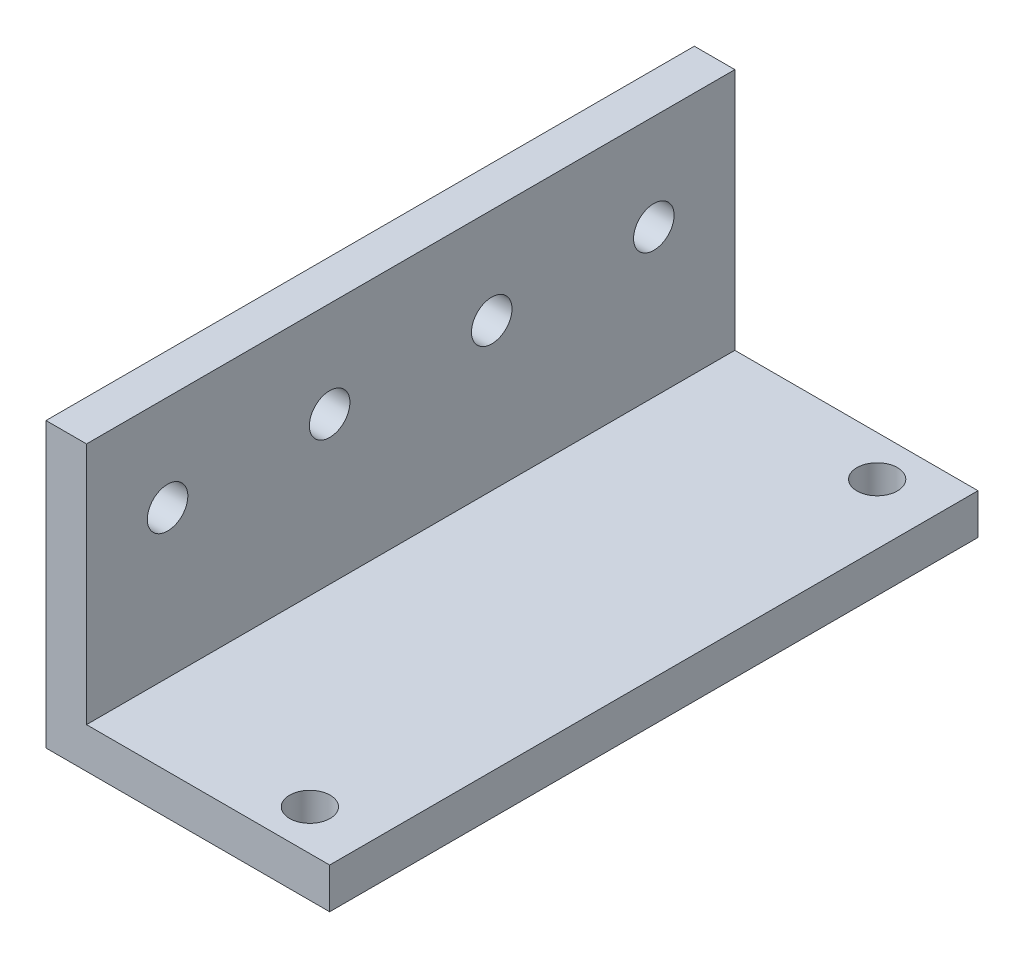
ISO-10303-21;
HEADER;
FILE_DESCRIPTION(('STEP AP214'),'2;1');
FILE_NAME('part.step','',(''),(''),'','','');
FILE_SCHEMA(('AUTOMOTIVE_DESIGN { 1 0 10303 214 1 1 1 1 }'));
ENDSEC;
DATA;
#1=APPLICATION_CONTEXT('core data for automotive mechanical design processes');
#2=APPLICATION_PROTOCOL_DEFINITION('international standard','automotive_design',2000,#1);
#3=PRODUCT_CONTEXT('',#1,'mechanical');
#4=PRODUCT('Part','Part','',(#3));
#5=PRODUCT_RELATED_PRODUCT_CATEGORY('part','',(#4));
#6=PRODUCT_DEFINITION_FORMATION('','',#4);
#7=PRODUCT_DEFINITION_CONTEXT('part definition',#1,'design');
#8=PRODUCT_DEFINITION('design','',#6,#7);
#9=PRODUCT_DEFINITION_SHAPE('','',#8);
#10=(LENGTH_UNIT() NAMED_UNIT(*) SI_UNIT(.MILLI.,.METRE.));
#11=(NAMED_UNIT(*) PLANE_ANGLE_UNIT() SI_UNIT($,.RADIAN.));
#12=(NAMED_UNIT(*) SI_UNIT($,.STERADIAN.) SOLID_ANGLE_UNIT());
#13=UNCERTAINTY_MEASURE_WITH_UNIT(LENGTH_MEASURE(1.E-05),#10,'distance_accuracy_value','');
#14=(GEOMETRIC_REPRESENTATION_CONTEXT(3) GLOBAL_UNCERTAINTY_ASSIGNED_CONTEXT((#13)) GLOBAL_UNIT_ASSIGNED_CONTEXT((#10,
#11,#12)) REPRESENTATION_CONTEXT('',''));
#15=CARTESIAN_POINT('',(0.,0.,0.));
#16=DIRECTION('',(0.,0.,1.));
#17=DIRECTION('',(1.,0.,0.));
#18=AXIS2_PLACEMENT_3D('',#15,#16,#17);
#19=CARTESIAN_POINT('',(6.35000000000001,0.,101.6));
#20=DIRECTION('',(1.,0.,0.));
#21=DIRECTION('',(0.,1.,0.));
#22=AXIS2_PLACEMENT_3D('',#19,#20,#21);
#23=PLANE('',#22);
#24=CARTESIAN_POINT('',(6.35,29.45,38.1));
#25=DIRECTION('',(1.,0.,0.));
#26=DIRECTION('',(0.,1.,0.));
#27=AXIS2_PLACEMENT_3D('',#24,#25,#26);
#28=CIRCLE('',#27,3.175);
#29=CARTESIAN_POINT('',(6.35,32.625,38.1));
#30=VERTEX_POINT('',#29);
#31=EDGE_CURVE('E154',#30,#30,#28,.T.);
#32=ORIENTED_EDGE('',*,*,#31,.F.);
#33=EDGE_LOOP('',(#32));
#34=FACE_BOUND('',#33,.T.);
#35=CARTESIAN_POINT('',(6.35,29.45,88.9));
#36=DIRECTION('',(1.,0.,0.));
#37=DIRECTION('',(0.,1.,0.));
#38=AXIS2_PLACEMENT_3D('',#35,#36,#37);
#39=CIRCLE('',#38,3.175);
#40=CARTESIAN_POINT('',(6.35,32.625,88.9));
#41=VERTEX_POINT('',#40);
#42=EDGE_CURVE('E144',#41,#41,#39,.T.);
#43=ORIENTED_EDGE('',*,*,#42,.F.);
#44=EDGE_LOOP('',(#43));
#45=FACE_BOUND('',#44,.T.);
#46=CARTESIAN_POINT('',(6.35,29.45,63.5));
#47=DIRECTION('',(1.,0.,0.));
#48=DIRECTION('',(0.,1.,0.));
#49=AXIS2_PLACEMENT_3D('',#46,#47,#48);
#50=CIRCLE('',#49,3.175);
#51=CARTESIAN_POINT('',(6.35,32.625,63.5));
#52=VERTEX_POINT('',#51);
#53=EDGE_CURVE('E141',#52,#52,#50,.T.);
#54=ORIENTED_EDGE('',*,*,#53,.F.);
#55=EDGE_LOOP('',(#54));
#56=FACE_BOUND('',#55,.T.);
#57=CARTESIAN_POINT('',(6.35,29.45,12.7));
#58=DIRECTION('',(1.,0.,0.));
#59=DIRECTION('',(0.,1.,0.));
#60=AXIS2_PLACEMENT_3D('',#57,#58,#59);
#61=CIRCLE('',#60,3.175);
#62=CARTESIAN_POINT('',(6.35,32.625,12.7));
#63=VERTEX_POINT('',#62);
#64=EDGE_CURVE('E138',#63,#63,#61,.T.);
#65=ORIENTED_EDGE('',*,*,#64,.F.);
#66=EDGE_LOOP('',(#65));
#67=FACE_BOUND('',#66,.T.);
#68=DIRECTION('',(0.,-1.,0.));
#69=VECTOR('',#68,1.);
#70=CARTESIAN_POINT('',(6.35000000000001,0.,0.));
#71=LINE('',#70,#69);
#72=CARTESIAN_POINT('',(6.35,44.45,0.));
#73=VERTEX_POINT('',#72);
#74=CARTESIAN_POINT('',(6.35000000000001,6.34999999999999,0.));
#75=VERTEX_POINT('',#74);
#76=EDGE_CURVE('E115',#73,#75,#71,.T.);
#77=ORIENTED_EDGE('',*,*,#76,.F.);
#78=DIRECTION('',(0.,0.,-1.));
#79=VECTOR('',#78,1.);
#80=CARTESIAN_POINT('',(6.35,44.45,101.6));
#81=LINE('',#80,#79);
#82=CARTESIAN_POINT('',(6.35,44.45,101.6));
#83=VERTEX_POINT('',#82);
#84=EDGE_CURVE('E11',#83,#73,#81,.T.);
#85=ORIENTED_EDGE('',*,*,#84,.F.);
#86=DIRECTION('',(0.,-1.,0.));
#87=VECTOR('',#86,1.);
#88=CARTESIAN_POINT('',(6.35000000000001,0.,101.6));
#89=LINE('',#88,#87);
#90=CARTESIAN_POINT('',(6.35000000000001,6.34999999999999,101.6));
#91=VERTEX_POINT('',#90);
#92=EDGE_CURVE('E129',#83,#91,#89,.T.);
#93=ORIENTED_EDGE('',*,*,#92,.T.);
#94=DIRECTION('',(0.,0.,-1.));
#95=VECTOR('',#94,1.);
#96=CARTESIAN_POINT('',(6.35000000000001,6.34999999999999,101.6));
#97=LINE('',#96,#95);
#98=EDGE_CURVE('E80',#91,#75,#97,.T.);
#99=ORIENTED_EDGE('',*,*,#98,.T.);
#100=EDGE_LOOP('',(#77,#85,#93,#99));
#101=FACE_BOUND('',#100,.T.);
#102=ADVANCED_FACE('F33',(#34,#45,#56,#67,#101),#23,.T.);
#103=CARTESIAN_POINT('',(0.,44.45,101.6));
#104=DIRECTION('',(0.,1.,0.));
#105=DIRECTION('',(0.,0.,1.));
#106=AXIS2_PLACEMENT_3D('',#103,#104,#105);
#107=PLANE('',#106);
#108=DIRECTION('',(1.,0.,0.));
#109=VECTOR('',#108,1.);
#110=CARTESIAN_POINT('',(0.,44.45,0.));
#111=LINE('',#110,#109);
#112=CARTESIAN_POINT('',(0.,44.45,0.));
#113=VERTEX_POINT('',#112);
#114=EDGE_CURVE('E118',#113,#73,#111,.T.);
#115=ORIENTED_EDGE('',*,*,#114,.F.);
#116=DIRECTION('',(0.,0.,-1.));
#117=VECTOR('',#116,1.);
#118=CARTESIAN_POINT('',(0.,44.45,101.6));
#119=LINE('',#118,#117);
#120=CARTESIAN_POINT('',(0.,44.45,101.6));
#121=VERTEX_POINT('',#120);
#122=EDGE_CURVE('E42',#121,#113,#119,.T.);
#123=ORIENTED_EDGE('',*,*,#122,.F.);
#124=DIRECTION('',(1.,0.,0.));
#125=VECTOR('',#124,1.);
#126=CARTESIAN_POINT('',(0.,44.45,101.6));
#127=LINE('',#126,#125);
#128=EDGE_CURVE('E170',#121,#83,#127,.T.);
#129=ORIENTED_EDGE('',*,*,#128,.T.);
#130=ORIENTED_EDGE('',*,*,#84,.T.);
#131=EDGE_LOOP('',(#115,#123,#129,#130));
#132=FACE_BOUND('',#131,.T.);
#133=ADVANCED_FACE('F182',(#132),#107,.T.);
#134=CARTESIAN_POINT('',(0.,0.,101.6));
#135=DIRECTION('',(-1.,0.,0.));
#136=DIRECTION('',(0.,0.,1.));
#137=AXIS2_PLACEMENT_3D('',#134,#135,#136);
#138=PLANE('',#137);
#139=CARTESIAN_POINT('',(0.,29.45,38.1));
#140=DIRECTION('',(-1.,0.,0.));
#141=DIRECTION('',(0.,0.,1.));
#142=AXIS2_PLACEMENT_3D('',#139,#140,#141);
#143=CIRCLE('',#142,3.175);
#144=CARTESIAN_POINT('',(0.,29.45,41.275));
#145=VERTEX_POINT('',#144);
#146=EDGE_CURVE('E36',#145,#145,#143,.T.);
#147=ORIENTED_EDGE('',*,*,#146,.F.);
#148=EDGE_LOOP('',(#147));
#149=FACE_BOUND('',#148,.T.);
#150=CARTESIAN_POINT('',(0.,29.45,88.9));
#151=DIRECTION('',(-1.,0.,0.));
#152=DIRECTION('',(0.,0.,1.));
#153=AXIS2_PLACEMENT_3D('',#150,#151,#152);
#154=CIRCLE('',#153,3.175);
#155=CARTESIAN_POINT('',(0.,29.45,92.075));
#156=VERTEX_POINT('',#155);
#157=EDGE_CURVE('E142',#156,#156,#154,.T.);
#158=ORIENTED_EDGE('',*,*,#157,.F.);
#159=EDGE_LOOP('',(#158));
#160=FACE_BOUND('',#159,.T.);
#161=CARTESIAN_POINT('',(0.,29.45,63.5));
#162=DIRECTION('',(-1.,0.,0.));
#163=DIRECTION('',(0.,0.,1.));
#164=AXIS2_PLACEMENT_3D('',#161,#162,#163);
#165=CIRCLE('',#164,3.175);
#166=CARTESIAN_POINT('',(0.,29.45,66.675));
#167=VERTEX_POINT('',#166);
#168=EDGE_CURVE('E139',#167,#167,#165,.T.);
#169=ORIENTED_EDGE('',*,*,#168,.F.);
#170=EDGE_LOOP('',(#169));
#171=FACE_BOUND('',#170,.T.);
#172=CARTESIAN_POINT('',(0.,29.45,12.7));
#173=DIRECTION('',(-1.,0.,0.));
#174=DIRECTION('',(0.,0.,1.));
#175=AXIS2_PLACEMENT_3D('',#172,#173,#174);
#176=CIRCLE('',#175,3.175);
#177=CARTESIAN_POINT('',(0.,29.45,15.875));
#178=VERTEX_POINT('',#177);
#179=EDGE_CURVE('E134',#178,#178,#176,.T.);
#180=ORIENTED_EDGE('',*,*,#179,.F.);
#181=EDGE_LOOP('',(#180));
#182=FACE_BOUND('',#181,.T.);
#183=DIRECTION('',(0.,1.,0.));
#184=VECTOR('',#183,1.);
#185=CARTESIAN_POINT('',(0.,0.,0.));
#186=LINE('',#185,#184);
#187=CARTESIAN_POINT('',(0.,0.,0.));
#188=VERTEX_POINT('',#187);
#189=EDGE_CURVE('E122',#188,#113,#186,.T.);
#190=ORIENTED_EDGE('',*,*,#189,.F.);
#191=DIRECTION('',(0.,0.,-1.));
#192=VECTOR('',#191,1.);
#193=CARTESIAN_POINT('',(0.,0.,101.6));
#194=LINE('',#193,#192);
#195=CARTESIAN_POINT('',(0.,0.,101.6));
#196=VERTEX_POINT('',#195);
#197=EDGE_CURVE('E107',#196,#188,#194,.T.);
#198=ORIENTED_EDGE('',*,*,#197,.F.);
#199=DIRECTION('',(0.,1.,0.));
#200=VECTOR('',#199,1.);
#201=CARTESIAN_POINT('',(0.,0.,101.6));
#202=LINE('',#201,#200);
#203=EDGE_CURVE('E100',#196,#121,#202,.T.);
#204=ORIENTED_EDGE('',*,*,#203,.T.);
#205=ORIENTED_EDGE('',*,*,#122,.T.);
#206=EDGE_LOOP('',(#190,#198,#204,#205));
#207=FACE_BOUND('',#206,.T.);
#208=ADVANCED_FACE('F174',(#149,#160,#171,#182,#207),#138,.T.);
#209=CARTESIAN_POINT('',(0.,0.,101.6));
#210=DIRECTION('',(0.,1.,0.));
#211=DIRECTION('',(0.,0.,1.));
#212=AXIS2_PLACEMENT_3D('',#209,#210,#211);
#213=PLANE('',#212);
#214=CARTESIAN_POINT('',(35.0000000000047,0.,6.35));
#215=DIRECTION('',(0.,1.,0.));
#216=DIRECTION('',(0.,0.,1.));
#217=AXIS2_PLACEMENT_3D('',#214,#215,#216);
#218=CIRCLE('',#217,3.175);
#219=CARTESIAN_POINT('',(35.0000000000047,0.,9.525));
#220=VERTEX_POINT('',#219);
#221=EDGE_CURVE('E161',#220,#220,#218,.T.);
#222=ORIENTED_EDGE('',*,*,#221,.T.);
#223=EDGE_LOOP('',(#222));
#224=FACE_BOUND('',#223,.T.);
#225=CARTESIAN_POINT('',(35.0000000000047,0.,95.25));
#226=DIRECTION('',(0.,1.,0.));
#227=DIRECTION('',(0.,0.,1.));
#228=AXIS2_PLACEMENT_3D('',#225,#226,#227);
#229=CIRCLE('',#228,3.175);
#230=CARTESIAN_POINT('',(35.0000000000047,0.,98.425));
#231=VERTEX_POINT('',#230);
#232=EDGE_CURVE('E119',#231,#231,#229,.T.);
#233=ORIENTED_EDGE('',*,*,#232,.T.);
#234=EDGE_LOOP('',(#233));
#235=FACE_BOUND('',#234,.T.);
#236=DIRECTION('',(1.,0.,0.));
#237=VECTOR('',#236,1.);
#238=CARTESIAN_POINT('',(0.,0.,0.));
#239=LINE('',#238,#237);
#240=CARTESIAN_POINT('',(44.45,0.,0.));
#241=VERTEX_POINT('',#240);
#242=EDGE_CURVE('E106',#188,#241,#239,.T.);
#243=ORIENTED_EDGE('',*,*,#242,.T.);
#244=DIRECTION('',(0.,0.,-1.));
#245=VECTOR('',#244,1.);
#246=CARTESIAN_POINT('',(44.45,0.,101.6));
#247=LINE('',#246,#245);
#248=CARTESIAN_POINT('',(44.45,0.,101.6));
#249=VERTEX_POINT('',#248);
#250=EDGE_CURVE('E103',#249,#241,#247,.T.);
#251=ORIENTED_EDGE('',*,*,#250,.F.);
#252=DIRECTION('',(1.,0.,0.));
#253=VECTOR('',#252,1.);
#254=CARTESIAN_POINT('',(0.,0.,101.6));
#255=LINE('',#254,#253);
#256=EDGE_CURVE('E93',#196,#249,#255,.T.);
#257=ORIENTED_EDGE('',*,*,#256,.F.);
#258=ORIENTED_EDGE('',*,*,#197,.T.);
#259=EDGE_LOOP('',(#243,#251,#257,#258));
#260=FACE_BOUND('',#259,.T.);
#261=ADVANCED_FACE('F104',(#224,#235,#260),#213,.F.);
#262=CARTESIAN_POINT('',(44.45,0.,101.6));
#263=DIRECTION('',(-1.,0.,0.));
#264=DIRECTION('',(0.,0.,1.));
#265=AXIS2_PLACEMENT_3D('',#262,#263,#264);
#266=PLANE('',#265);
#267=DIRECTION('',(0.,1.,0.));
#268=VECTOR('',#267,1.);
#269=CARTESIAN_POINT('',(44.45,0.,0.));
#270=LINE('',#269,#268);
#271=CARTESIAN_POINT('',(44.45,6.35,0.));
#272=VERTEX_POINT('',#271);
#273=EDGE_CURVE('E73',#241,#272,#270,.T.);
#274=ORIENTED_EDGE('',*,*,#273,.T.);
#275=DIRECTION('',(0.,0.,-1.));
#276=VECTOR('',#275,1.);
#277=CARTESIAN_POINT('',(44.45,6.35,101.6));
#278=LINE('',#277,#276);
#279=CARTESIAN_POINT('',(44.45,6.35,101.6));
#280=VERTEX_POINT('',#279);
#281=EDGE_CURVE('E108',#280,#272,#278,.T.);
#282=ORIENTED_EDGE('',*,*,#281,.F.);
#283=DIRECTION('',(0.,1.,0.));
#284=VECTOR('',#283,1.);
#285=CARTESIAN_POINT('',(44.45,0.,101.6));
#286=LINE('',#285,#284);
#287=EDGE_CURVE('E97',#249,#280,#286,.T.);
#288=ORIENTED_EDGE('',*,*,#287,.F.);
#289=ORIENTED_EDGE('',*,*,#250,.T.);
#290=EDGE_LOOP('',(#274,#282,#288,#289));
#291=FACE_BOUND('',#290,.T.);
#292=ADVANCED_FACE('F110',(#291),#266,.F.);
#293=CARTESIAN_POINT('',(0.,6.34999999999999,101.6));
#294=DIRECTION('',(0.,-1.,0.));
#295=DIRECTION('',(1.,0.,0.));
#296=AXIS2_PLACEMENT_3D('',#293,#294,#295);
#297=PLANE('',#296);
#298=CARTESIAN_POINT('',(35.0000000000047,6.35,6.35));
#299=DIRECTION('',(0.,1.,0.));
#300=DIRECTION('',(-1.,0.,0.));
#301=AXIS2_PLACEMENT_3D('',#298,#299,#300);
#302=CIRCLE('',#301,3.175);
#303=CARTESIAN_POINT('',(31.8250000000047,6.35,6.35));
#304=VERTEX_POINT('',#303);
#305=EDGE_CURVE('E137',#304,#304,#302,.T.);
#306=ORIENTED_EDGE('',*,*,#305,.F.);
#307=EDGE_LOOP('',(#306));
#308=FACE_BOUND('',#307,.T.);
#309=CARTESIAN_POINT('',(35.0000000000047,6.35,95.25));
#310=DIRECTION('',(0.,1.,0.));
#311=DIRECTION('',(-1.,0.,0.));
#312=AXIS2_PLACEMENT_3D('',#309,#310,#311);
#313=CIRCLE('',#312,3.175);
#314=CARTESIAN_POINT('',(31.8250000000047,6.35,95.25));
#315=VERTEX_POINT('',#314);
#316=EDGE_CURVE('E164',#315,#315,#313,.T.);
#317=ORIENTED_EDGE('',*,*,#316,.F.);
#318=EDGE_LOOP('',(#317));
#319=FACE_BOUND('',#318,.T.);
#320=DIRECTION('',(-1.,0.,0.));
#321=VECTOR('',#320,1.);
#322=CARTESIAN_POINT('',(0.,6.34999999999999,0.));
#323=LINE('',#322,#321);
#324=EDGE_CURVE('E127',#272,#75,#323,.T.);
#325=ORIENTED_EDGE('',*,*,#324,.T.);
#326=ORIENTED_EDGE('',*,*,#98,.F.);
#327=DIRECTION('',(-1.,0.,0.));
#328=VECTOR('',#327,1.);
#329=CARTESIAN_POINT('',(0.,6.34999999999999,101.6));
#330=LINE('',#329,#328);
#331=EDGE_CURVE('E51',#280,#91,#330,.T.);
#332=ORIENTED_EDGE('',*,*,#331,.F.);
#333=ORIENTED_EDGE('',*,*,#281,.T.);
#334=EDGE_LOOP('',(#325,#326,#332,#333));
#335=FACE_BOUND('',#334,.T.);
#336=ADVANCED_FACE('F180',(#308,#319,#335),#297,.F.);
#337=CARTESIAN_POINT('',(0.,0.,101.6));
#338=DIRECTION('',(0.,0.,1.));
#339=DIRECTION('',(1.,0.,0.));
#340=AXIS2_PLACEMENT_3D('',#337,#338,#339);
#341=PLANE('',#340);
#342=ORIENTED_EDGE('',*,*,#92,.F.);
#343=ORIENTED_EDGE('',*,*,#128,.F.);
#344=ORIENTED_EDGE('',*,*,#203,.F.);
#345=ORIENTED_EDGE('',*,*,#256,.T.);
#346=ORIENTED_EDGE('',*,*,#287,.T.);
#347=ORIENTED_EDGE('',*,*,#331,.T.);
#348=EDGE_LOOP('',(#342,#343,#344,#345,#346,#347));
#349=FACE_BOUND('',#348,.T.);
#350=ADVANCED_FACE('F95',(#349),#341,.T.);
#351=CARTESIAN_POINT('',(0.,0.,0.));
#352=DIRECTION('',(0.,0.,1.));
#353=DIRECTION('',(1.,0.,0.));
#354=AXIS2_PLACEMENT_3D('',#351,#352,#353);
#355=PLANE('',#354);
#356=ORIENTED_EDGE('',*,*,#76,.T.);
#357=ORIENTED_EDGE('',*,*,#324,.F.);
#358=ORIENTED_EDGE('',*,*,#273,.F.);
#359=ORIENTED_EDGE('',*,*,#242,.F.);
#360=ORIENTED_EDGE('',*,*,#189,.T.);
#361=ORIENTED_EDGE('',*,*,#114,.T.);
#362=EDGE_LOOP('',(#356,#357,#358,#359,#360,#361));
#363=FACE_BOUND('',#362,.T.);
#364=ADVANCED_FACE('F177',(#363),#355,.F.);
#365=CARTESIAN_POINT('',(35.0000000000047,-18.796,95.25));
#366=DIRECTION('',(0.,1.,0.));
#367=DIRECTION('',(-1.,0.,0.));
#368=AXIS2_PLACEMENT_3D('',#365,#366,#367);
#369=CYLINDRICAL_SURFACE('',#368,3.175);
#370=ORIENTED_EDGE('',*,*,#316,.T.);
#371=EDGE_LOOP('',(#370));
#372=FACE_BOUND('',#371,.T.);
#373=ORIENTED_EDGE('',*,*,#232,.F.);
#374=EDGE_LOOP('',(#373));
#375=FACE_BOUND('',#374,.T.);
#376=ADVANCED_FACE('F204',(#372,#375),#369,.F.);
#377=CARTESIAN_POINT('',(35.0000000000047,-18.796,6.35));
#378=DIRECTION('',(0.,1.,0.));
#379=DIRECTION('',(-1.,0.,0.));
#380=AXIS2_PLACEMENT_3D('',#377,#378,#379);
#381=CYLINDRICAL_SURFACE('',#380,3.175);
#382=ORIENTED_EDGE('',*,*,#305,.T.);
#383=EDGE_LOOP('',(#382));
#384=FACE_BOUND('',#383,.T.);
#385=ORIENTED_EDGE('',*,*,#221,.F.);
#386=EDGE_LOOP('',(#385));
#387=FACE_BOUND('',#386,.T.);
#388=ADVANCED_FACE('F209',(#384,#387),#381,.F.);
#389=CARTESIAN_POINT('',(-18.796,29.45,12.7));
#390=DIRECTION('',(1.,0.,0.));
#391=DIRECTION('',(0.,1.,0.));
#392=AXIS2_PLACEMENT_3D('',#389,#390,#391);
#393=CYLINDRICAL_SURFACE('',#392,3.175);
#394=ORIENTED_EDGE('',*,*,#179,.T.);
#395=EDGE_LOOP('',(#394));
#396=FACE_BOUND('',#395,.T.);
#397=ORIENTED_EDGE('',*,*,#64,.T.);
#398=EDGE_LOOP('',(#397));
#399=FACE_BOUND('',#398,.T.);
#400=ADVANCED_FACE('F213',(#396,#399),#393,.F.);
#401=CARTESIAN_POINT('',(-18.796,29.45,63.5));
#402=DIRECTION('',(1.,0.,0.));
#403=DIRECTION('',(0.,1.,0.));
#404=AXIS2_PLACEMENT_3D('',#401,#402,#403);
#405=CYLINDRICAL_SURFACE('',#404,3.175);
#406=ORIENTED_EDGE('',*,*,#168,.T.);
#407=EDGE_LOOP('',(#406));
#408=FACE_BOUND('',#407,.T.);
#409=ORIENTED_EDGE('',*,*,#53,.T.);
#410=EDGE_LOOP('',(#409));
#411=FACE_BOUND('',#410,.T.);
#412=ADVANCED_FACE('F217',(#408,#411),#405,.F.);
#413=CARTESIAN_POINT('',(-18.796,29.45,88.9));
#414=DIRECTION('',(1.,0.,0.));
#415=DIRECTION('',(0.,1.,0.));
#416=AXIS2_PLACEMENT_3D('',#413,#414,#415);
#417=CYLINDRICAL_SURFACE('',#416,3.175);
#418=ORIENTED_EDGE('',*,*,#157,.T.);
#419=EDGE_LOOP('',(#418));
#420=FACE_BOUND('',#419,.T.);
#421=ORIENTED_EDGE('',*,*,#42,.T.);
#422=EDGE_LOOP('',(#421));
#423=FACE_BOUND('',#422,.T.);
#424=ADVANCED_FACE('F221',(#420,#423),#417,.F.);
#425=CARTESIAN_POINT('',(-18.796,29.45,38.1));
#426=DIRECTION('',(1.,0.,0.));
#427=DIRECTION('',(0.,1.,0.));
#428=AXIS2_PLACEMENT_3D('',#425,#426,#427);
#429=CYLINDRICAL_SURFACE('',#428,3.175);
#430=ORIENTED_EDGE('',*,*,#146,.T.);
#431=EDGE_LOOP('',(#430));
#432=FACE_BOUND('',#431,.T.);
#433=ORIENTED_EDGE('',*,*,#31,.T.);
#434=EDGE_LOOP('',(#433));
#435=FACE_BOUND('',#434,.T.);
#436=ADVANCED_FACE('F225',(#432,#435),#429,.F.);
#437=CLOSED_SHELL('',(#102,#133,#208,#261,#292,#336,#350,#364,#376,#388,#400,#412,#424,#436));
#438=MANIFOLD_SOLID_BREP('B2',#437);
#439=ADVANCED_BREP_SHAPE_REPRESENTATION('',(#18,#438),#14);
#440=SHAPE_DEFINITION_REPRESENTATION(#9,#439);
ENDSEC;
END-ISO-10303-21;
